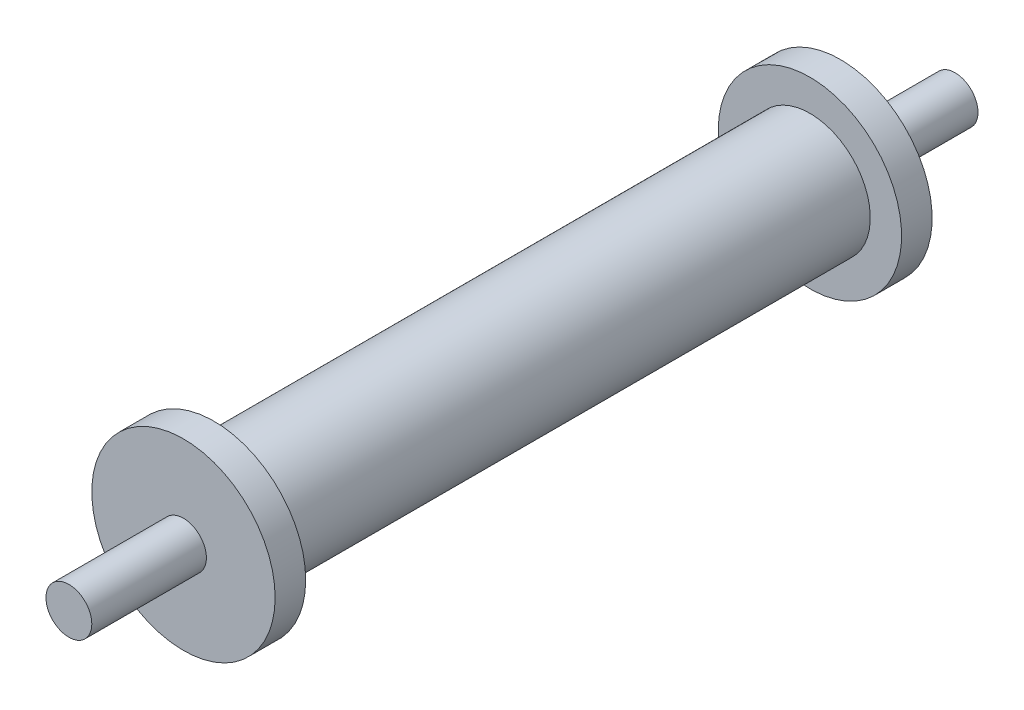
ISO-10303-21;
HEADER;
FILE_DESCRIPTION(('STEP AP214'),'2;1');
FILE_NAME('part.step','',(''),(''),'','','');
FILE_SCHEMA(('AUTOMOTIVE_DESIGN { 1 0 10303 214 1 1 1 1 }'));
ENDSEC;
DATA;
#1=APPLICATION_CONTEXT('core data for automotive mechanical design processes');
#2=APPLICATION_PROTOCOL_DEFINITION('international standard','automotive_design',2000,#1);
#3=PRODUCT_CONTEXT('',#1,'mechanical');
#4=PRODUCT('Part','Part','',(#3));
#5=PRODUCT_RELATED_PRODUCT_CATEGORY('part','',(#4));
#6=PRODUCT_DEFINITION_FORMATION('','',#4);
#7=PRODUCT_DEFINITION_CONTEXT('part definition',#1,'design');
#8=PRODUCT_DEFINITION('design','',#6,#7);
#9=PRODUCT_DEFINITION_SHAPE('','',#8);
#10=(LENGTH_UNIT() NAMED_UNIT(*) SI_UNIT(.MILLI.,.METRE.));
#11=(NAMED_UNIT(*) PLANE_ANGLE_UNIT() SI_UNIT($,.RADIAN.));
#12=(NAMED_UNIT(*) SI_UNIT($,.STERADIAN.) SOLID_ANGLE_UNIT());
#13=UNCERTAINTY_MEASURE_WITH_UNIT(LENGTH_MEASURE(1.E-05),#10,'distance_accuracy_value','');
#14=(GEOMETRIC_REPRESENTATION_CONTEXT(3) GLOBAL_UNCERTAINTY_ASSIGNED_CONTEXT((#13)) GLOBAL_UNIT_ASSIGNED_CONTEXT((#10,
#11,#12)) REPRESENTATION_CONTEXT('',''));
#15=CARTESIAN_POINT('',(0.,0.,0.));
#16=DIRECTION('',(0.,0.,1.));
#17=DIRECTION('',(1.,0.,0.));
#18=AXIS2_PLACEMENT_3D('',#15,#16,#17);
#19=CARTESIAN_POINT('',(0.,0.,58.));
#20=DIRECTION('',(0.,0.,-1.));
#21=DIRECTION('',(-1.,0.,0.));
#22=AXIS2_PLACEMENT_3D('',#19,#20,#21);
#23=CYLINDRICAL_SURFACE('',#22,3.95);
#24=CARTESIAN_POINT('',(0.,0.,48.5));
#25=DIRECTION('',(0.,0.,1.));
#26=DIRECTION('',(1.,0.,0.));
#27=AXIS2_PLACEMENT_3D('',#24,#25,#26);
#28=CIRCLE('',#27,3.95);
#29=CARTESIAN_POINT('',(-3.95,0.,48.5));
#30=VERTEX_POINT('',#29);
#31=EDGE_CURVE('E38',#30,#30,#28,.T.);
#32=CARTESIAN_POINT('',(0.,0.,9.5));
#33=DIRECTION('',(0.,0.,-1.));
#34=DIRECTION('',(-1.,0.,0.));
#35=AXIS2_PLACEMENT_3D('',#32,#33,#34);
#36=CIRCLE('',#35,3.95);
#37=CARTESIAN_POINT('',(-3.95,0.,9.50000000000001));
#38=VERTEX_POINT('',#37);
#39=EDGE_CURVE('E10',#38,#38,#36,.T.);
#40=CARTESIAN_POINT('',(-3.95,0.,48.5));
#41=CARTESIAN_POINT('',(-3.95,0.,48.09375));
#42=CARTESIAN_POINT('',(-3.95,0.,47.6875));
#43=CARTESIAN_POINT('',(-3.95,0.,46.875));
#44=CARTESIAN_POINT('',(-3.95,0.,46.46875));
#45=CARTESIAN_POINT('',(-3.95,0.,45.65625));
#46=CARTESIAN_POINT('',(-3.95,0.,45.25));
#47=CARTESIAN_POINT('',(-3.95,0.,44.4375));
#48=CARTESIAN_POINT('',(-3.95,0.,44.03125));
#49=CARTESIAN_POINT('',(-3.95,0.,43.21875));
#50=CARTESIAN_POINT('',(-3.95,0.,42.8125));
#51=CARTESIAN_POINT('',(-3.95,0.,42.));
#52=CARTESIAN_POINT('',(-3.95,0.,41.59375));
#53=CARTESIAN_POINT('',(-3.95,0.,40.78125));
#54=CARTESIAN_POINT('',(-3.95,0.,40.375));
#55=CARTESIAN_POINT('',(-3.95,0.,39.5625));
#56=CARTESIAN_POINT('',(-3.95,0.,39.15625));
#57=CARTESIAN_POINT('',(-3.95,0.,38.34375));
#58=CARTESIAN_POINT('',(-3.95,0.,37.9375));
#59=CARTESIAN_POINT('',(-3.95,0.,37.125));
#60=CARTESIAN_POINT('',(-3.95,0.,36.71875));
#61=CARTESIAN_POINT('',(-3.95,0.,35.90625));
#62=CARTESIAN_POINT('',(-3.95,0.,35.5));
#63=CARTESIAN_POINT('',(-3.95,0.,34.6875));
#64=CARTESIAN_POINT('',(-3.95,0.,34.28125));
#65=CARTESIAN_POINT('',(-3.95,0.,33.46875));
#66=CARTESIAN_POINT('',(-3.95,0.,33.0625));
#67=CARTESIAN_POINT('',(-3.95,0.,32.25));
#68=CARTESIAN_POINT('',(-3.95,0.,31.84375));
#69=CARTESIAN_POINT('',(-3.95,0.,31.03125));
#70=CARTESIAN_POINT('',(-3.95,0.,30.625));
#71=CARTESIAN_POINT('',(-3.95,0.,29.8125));
#72=CARTESIAN_POINT('',(-3.95,0.,29.40625));
#73=CARTESIAN_POINT('',(-3.95,0.,28.59375));
#74=CARTESIAN_POINT('',(-3.95,0.,28.1875));
#75=CARTESIAN_POINT('',(-3.95,0.,27.375));
#76=CARTESIAN_POINT('',(-3.95,0.,26.96875));
#77=CARTESIAN_POINT('',(-3.95,0.,26.15625));
#78=CARTESIAN_POINT('',(-3.95,0.,25.75));
#79=CARTESIAN_POINT('',(-3.95,0.,24.9375));
#80=CARTESIAN_POINT('',(-3.95,0.,24.53125));
#81=CARTESIAN_POINT('',(-3.95,0.,23.71875));
#82=CARTESIAN_POINT('',(-3.95,0.,23.3125));
#83=CARTESIAN_POINT('',(-3.95,0.,22.5));
#84=CARTESIAN_POINT('',(-3.95,0.,22.09375));
#85=CARTESIAN_POINT('',(-3.95,0.,21.28125));
#86=CARTESIAN_POINT('',(-3.95,0.,20.875));
#87=CARTESIAN_POINT('',(-3.95,0.,20.0625));
#88=CARTESIAN_POINT('',(-3.95,0.,19.65625));
#89=CARTESIAN_POINT('',(-3.95,0.,18.84375));
#90=CARTESIAN_POINT('',(-3.95,0.,18.4375));
#91=CARTESIAN_POINT('',(-3.95,0.,17.625));
#92=CARTESIAN_POINT('',(-3.95,0.,17.21875));
#93=CARTESIAN_POINT('',(-3.95,0.,16.40625));
#94=CARTESIAN_POINT('',(-3.95,0.,16.));
#95=CARTESIAN_POINT('',(-3.95,0.,15.1875));
#96=CARTESIAN_POINT('',(-3.95,0.,14.78125));
#97=CARTESIAN_POINT('',(-3.95,0.,13.96875));
#98=CARTESIAN_POINT('',(-3.95,0.,13.5625));
#99=CARTESIAN_POINT('',(-3.95,0.,12.75));
#100=CARTESIAN_POINT('',(-3.95,0.,12.34375));
#101=CARTESIAN_POINT('',(-3.95,0.,11.53125));
#102=CARTESIAN_POINT('',(-3.95,0.,11.125));
#103=CARTESIAN_POINT('',(-3.95,0.,10.3125));
#104=CARTESIAN_POINT('',(-3.95,0.,9.90625000000001));
#105=CARTESIAN_POINT('',(-3.95,0.,9.50000000000001));
#106=B_SPLINE_CURVE_WITH_KNOTS('',3,(#40,#41,#42,#43,#44,#45,#46,#47,#48,#49,#50,#51,#52,#53,
#54,#55,#56,#57,#58,#59,#60,#61,#62,#63,#64,#65,#66,#67,#68,#69,#70,#71,#72,#73,#74,#75,#76,#77,
#78,#79,#80,#81,#82,#83,#84,#85,#86,#87,#88,#89,#90,#91,#92,#93,#94,#95,#96,#97,#98,#99,#100,
#101,#102,#103,#104,#105),.UNSPECIFIED.,.F.,.F.,(4,2,2,2,2,2,2,2,2,2,2,2,2,2,2,2,2,2,2,2,2,2,2,
2,2,2,2,2,2,2,2,2,4),(0.,1.21875,2.4375,3.65625,4.875,6.09374999999999,7.31249999999999,8.53125,
9.74999999999999,10.96875,12.1875,13.40625,14.625,15.84375,17.0625,18.28125,19.5,20.71875,
21.9375,23.15625,24.375,25.59375,26.8125,28.03125,29.25,30.46875,31.6875,32.90625,34.125,
35.34375,36.5625,37.78125,39.),.UNSPECIFIED.);
#107=EDGE_CURVE('BSEAM31',#30,#38,#106,.T.);
#108=ORIENTED_EDGE('',*,*,#31,.F.);
#109=ORIENTED_EDGE('',*,*,#39,.F.);
#110=ORIENTED_EDGE('',*,*,#107,.T.);
#111=ORIENTED_EDGE('',*,*,#107,.F.);
#112=EDGE_LOOP('',(#108,#110,#109,#111));
#113=FACE_BOUND('',#112,.T.);
#114=ADVANCED_FACE('F31',(#113),#23,.T.);
#115=CARTESIAN_POINT('',(0.,0.,48.5));
#116=DIRECTION('',(0.,0.,1.));
#117=DIRECTION('',(1.,0.,0.));
#118=AXIS2_PLACEMENT_3D('',#115,#116,#117);
#119=CYLINDRICAL_SURFACE('',#118,6.);
#120=CARTESIAN_POINT('',(0.,0.,48.5));
#121=DIRECTION('',(0.,0.,1.));
#122=DIRECTION('',(1.,0.,0.));
#123=AXIS2_PLACEMENT_3D('',#120,#121,#122);
#124=CIRCLE('',#123,6.);
#125=CARTESIAN_POINT('',(6.,0.,48.5));
#126=VERTEX_POINT('',#125);
#127=EDGE_CURVE('E43',#126,#126,#124,.T.);
#128=ORIENTED_EDGE('',*,*,#127,.T.);
#129=EDGE_LOOP('',(#128));
#130=FACE_BOUND('',#129,.T.);
#131=CARTESIAN_POINT('',(0.,0.,50.5));
#132=DIRECTION('',(0.,0.,1.));
#133=DIRECTION('',(1.,0.,0.));
#134=AXIS2_PLACEMENT_3D('',#131,#132,#133);
#135=CIRCLE('',#134,6.);
#136=CARTESIAN_POINT('',(6.,0.,50.5));
#137=VERTEX_POINT('',#136);
#138=EDGE_CURVE('E64',#137,#137,#135,.T.);
#139=ORIENTED_EDGE('',*,*,#138,.F.);
#140=EDGE_LOOP('',(#139));
#141=FACE_BOUND('',#140,.T.);
#142=ADVANCED_FACE('F73',(#130,#141),#119,.T.);
#143=CARTESIAN_POINT('',(0.,0.,48.5));
#144=DIRECTION('',(0.,0.,1.));
#145=DIRECTION('',(1.,0.,0.));
#146=AXIS2_PLACEMENT_3D('',#143,#144,#145);
#147=PLANE('',#146);
#148=ORIENTED_EDGE('',*,*,#31,.T.);
#149=EDGE_LOOP('',(#148));
#150=FACE_BOUND('',#149,.T.);
#151=ORIENTED_EDGE('',*,*,#127,.F.);
#152=EDGE_LOOP('',(#151));
#153=FACE_BOUND('',#152,.T.);
#154=ADVANCED_FACE('F75',(#150,#153),#147,.F.);
#155=CARTESIAN_POINT('',(0.,0.,50.5));
#156=DIRECTION('',(0.,0.,1.));
#157=DIRECTION('',(1.,0.,0.));
#158=AXIS2_PLACEMENT_3D('',#155,#156,#157);
#159=PLANE('',#158);
#160=ORIENTED_EDGE('',*,*,#138,.T.);
#161=EDGE_LOOP('',(#160));
#162=FACE_BOUND('',#161,.T.);
#163=CARTESIAN_POINT('',(0.,0.,50.5));
#164=DIRECTION('',(0.,0.,1.));
#165=DIRECTION('',(1.,0.,0.));
#166=AXIS2_PLACEMENT_3D('',#163,#164,#165);
#167=CIRCLE('',#166,1.5);
#168=CARTESIAN_POINT('',(1.5,0.,50.5));
#169=VERTEX_POINT('',#168);
#170=EDGE_CURVE('E49',#169,#169,#167,.T.);
#171=ORIENTED_EDGE('',*,*,#170,.F.);
#172=EDGE_LOOP('',(#171));
#173=FACE_BOUND('',#172,.T.);
#174=ADVANCED_FACE('F70',(#162,#173),#159,.T.);
#175=CARTESIAN_POINT('',(0.,0.,9.5));
#176=DIRECTION('',(0.,0.,-1.));
#177=DIRECTION('',(-1.,0.,0.));
#178=AXIS2_PLACEMENT_3D('',#175,#176,#177);
#179=CYLINDRICAL_SURFACE('',#178,6.);
#180=CARTESIAN_POINT('',(0.,0.,9.5));
#181=DIRECTION('',(0.,0.,-1.));
#182=DIRECTION('',(-1.,0.,0.));
#183=AXIS2_PLACEMENT_3D('',#180,#181,#182);
#184=CIRCLE('',#183,6.);
#185=CARTESIAN_POINT('',(-6.,0.,9.5));
#186=VERTEX_POINT('',#185);
#187=EDGE_CURVE('E53',#186,#186,#184,.T.);
#188=ORIENTED_EDGE('',*,*,#187,.T.);
#189=EDGE_LOOP('',(#188));
#190=FACE_BOUND('',#189,.T.);
#191=CARTESIAN_POINT('',(0.,0.,7.5));
#192=DIRECTION('',(0.,0.,-1.));
#193=DIRECTION('',(-1.,0.,0.));
#194=AXIS2_PLACEMENT_3D('',#191,#192,#193);
#195=CIRCLE('',#194,6.);
#196=CARTESIAN_POINT('',(-6.,0.,7.5));
#197=VERTEX_POINT('',#196);
#198=EDGE_CURVE('E48',#197,#197,#195,.T.);
#199=ORIENTED_EDGE('',*,*,#198,.F.);
#200=EDGE_LOOP('',(#199));
#201=FACE_BOUND('',#200,.T.);
#202=ADVANCED_FACE('F112',(#190,#201),#179,.T.);
#203=CARTESIAN_POINT('',(0.,0.,9.5));
#204=DIRECTION('',(0.,0.,-1.));
#205=DIRECTION('',(-1.,0.,0.));
#206=AXIS2_PLACEMENT_3D('',#203,#204,#205);
#207=PLANE('',#206);
#208=ORIENTED_EDGE('',*,*,#39,.T.);
#209=EDGE_LOOP('',(#208));
#210=FACE_BOUND('',#209,.T.);
#211=ORIENTED_EDGE('',*,*,#187,.F.);
#212=EDGE_LOOP('',(#211));
#213=FACE_BOUND('',#212,.T.);
#214=ADVANCED_FACE('F109',(#210,#213),#207,.F.);
#215=CARTESIAN_POINT('',(0.,0.,7.5));
#216=DIRECTION('',(0.,0.,-1.));
#217=DIRECTION('',(-1.,0.,0.));
#218=AXIS2_PLACEMENT_3D('',#215,#216,#217);
#219=PLANE('',#218);
#220=ORIENTED_EDGE('',*,*,#198,.T.);
#221=EDGE_LOOP('',(#220));
#222=FACE_BOUND('',#221,.T.);
#223=CARTESIAN_POINT('',(0.,0.,7.5));
#224=DIRECTION('',(0.,0.,-1.));
#225=DIRECTION('',(-1.,0.,0.));
#226=AXIS2_PLACEMENT_3D('',#223,#224,#225);
#227=CIRCLE('',#226,1.5);
#228=CARTESIAN_POINT('',(-1.5,0.,7.5));
#229=VERTEX_POINT('',#228);
#230=EDGE_CURVE('E60',#229,#229,#227,.T.);
#231=ORIENTED_EDGE('',*,*,#230,.F.);
#232=EDGE_LOOP('',(#231));
#233=FACE_BOUND('',#232,.T.);
#234=ADVANCED_FACE('F108',(#222,#233),#219,.T.);
#235=CARTESIAN_POINT('',(0.,0.,60.5));
#236=DIRECTION('',(0.,0.,-1.));
#237=DIRECTION('',(-1.,0.,0.));
#238=AXIS2_PLACEMENT_3D('',#235,#236,#237);
#239=CYLINDRICAL_SURFACE('',#238,1.5);
#240=CARTESIAN_POINT('',(0.,0.,58.));
#241=DIRECTION('',(0.,0.,1.));
#242=DIRECTION('',(1.,0.,0.));
#243=AXIS2_PLACEMENT_3D('',#240,#241,#242);
#244=CIRCLE('',#243,1.5);
#245=CARTESIAN_POINT('',(1.5,0.,58.));
#246=VERTEX_POINT('',#245);
#247=EDGE_CURVE('E46',#246,#246,#244,.F.);
#248=ORIENTED_EDGE('',*,*,#247,.T.);
#249=EDGE_LOOP('',(#248));
#250=FACE_BOUND('',#249,.T.);
#251=ORIENTED_EDGE('',*,*,#170,.T.);
#252=EDGE_LOOP('',(#251));
#253=FACE_BOUND('',#252,.T.);
#254=ADVANCED_FACE('F90',(#250,#253),#239,.T.);
#255=CARTESIAN_POINT('',(0.,0.,58.));
#256=DIRECTION('',(0.,0.,1.));
#257=DIRECTION('',(1.,0.,0.));
#258=AXIS2_PLACEMENT_3D('',#255,#256,#257);
#259=PLANE('',#258);
#260=ORIENTED_EDGE('',*,*,#247,.F.);
#261=EDGE_LOOP('',(#260));
#262=FACE_BOUND('',#261,.T.);
#263=ADVANCED_FACE('F87',(#262),#259,.T.);
#264=CARTESIAN_POINT('',(0.,0.,-2.5));
#265=DIRECTION('',(0.,0.,1.));
#266=DIRECTION('',(1.,0.,0.));
#267=AXIS2_PLACEMENT_3D('',#264,#265,#266);
#268=CYLINDRICAL_SURFACE('',#267,1.5);
#269=ORIENTED_EDGE('',*,*,#230,.T.);
#270=EDGE_LOOP('',(#269));
#271=FACE_BOUND('',#270,.T.);
#272=CARTESIAN_POINT('',(0.,0.,0.));
#273=DIRECTION('',(0.,0.,1.));
#274=DIRECTION('',(1.,0.,0.));
#275=AXIS2_PLACEMENT_3D('',#272,#273,#274);
#276=CIRCLE('',#275,1.5);
#277=CARTESIAN_POINT('',(1.5,0.,0.));
#278=VERTEX_POINT('',#277);
#279=EDGE_CURVE('E34',#278,#278,#276,.F.);
#280=ORIENTED_EDGE('',*,*,#279,.F.);
#281=EDGE_LOOP('',(#280));
#282=FACE_BOUND('',#281,.T.);
#283=ADVANCED_FACE('F89',(#271,#282),#268,.T.);
#284=CARTESIAN_POINT('',(0.,0.,0.));
#285=DIRECTION('',(0.,0.,1.));
#286=DIRECTION('',(1.,0.,0.));
#287=AXIS2_PLACEMENT_3D('',#284,#285,#286);
#288=PLANE('',#287);
#289=ORIENTED_EDGE('',*,*,#279,.T.);
#290=EDGE_LOOP('',(#289));
#291=FACE_BOUND('',#290,.T.);
#292=ADVANCED_FACE('F92',(#291),#288,.F.);
#293=CLOSED_SHELL('',(#114,#142,#154,#174,#202,#214,#234,#254,#263,#283,#292));
#294=MANIFOLD_SOLID_BREP('B2',#293);
#295=ADVANCED_BREP_SHAPE_REPRESENTATION('',(#18,#294),#14);
#296=SHAPE_DEFINITION_REPRESENTATION(#9,#295);
ENDSEC;
END-ISO-10303-21;
